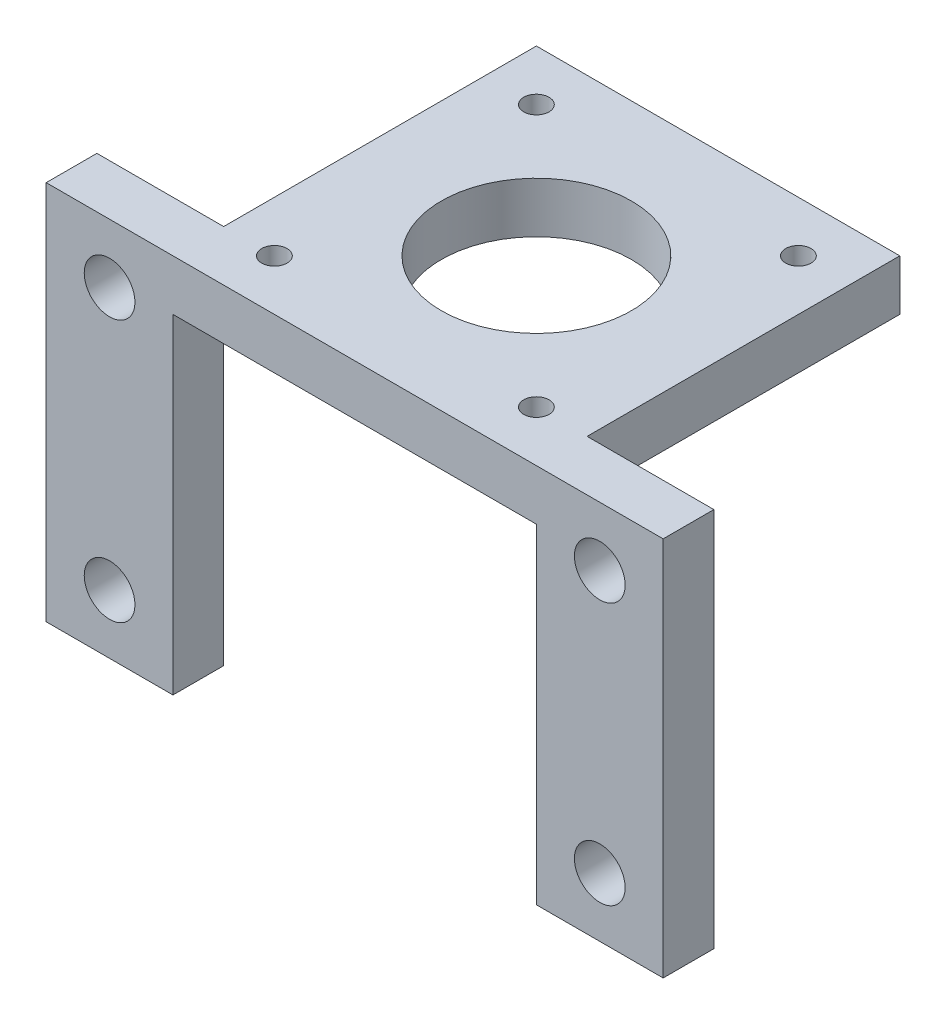
ISO-10303-21;
HEADER;
FILE_DESCRIPTION(('STEP AP214'),'2;1');
FILE_NAME('part.step','',(''),(''),'','','');
FILE_SCHEMA(('AUTOMOTIVE_DESIGN { 1 0 10303 214 1 1 1 1 }'));
ENDSEC;
DATA;
#1=APPLICATION_CONTEXT('core data for automotive mechanical design processes');
#2=APPLICATION_PROTOCOL_DEFINITION('international standard','automotive_design',2000,#1);
#3=PRODUCT_CONTEXT('',#1,'mechanical');
#4=PRODUCT('Part','Part','',(#3));
#5=PRODUCT_RELATED_PRODUCT_CATEGORY('part','',(#4));
#6=PRODUCT_DEFINITION_FORMATION('','',#4);
#7=PRODUCT_DEFINITION_CONTEXT('part definition',#1,'design');
#8=PRODUCT_DEFINITION('design','',#6,#7);
#9=PRODUCT_DEFINITION_SHAPE('','',#8);
#10=(LENGTH_UNIT() NAMED_UNIT(*) SI_UNIT(.MILLI.,.METRE.));
#11=(NAMED_UNIT(*) PLANE_ANGLE_UNIT() SI_UNIT($,.RADIAN.));
#12=(NAMED_UNIT(*) SI_UNIT($,.STERADIAN.) SOLID_ANGLE_UNIT());
#13=UNCERTAINTY_MEASURE_WITH_UNIT(LENGTH_MEASURE(1.E-05),#10,'distance_accuracy_value','');
#14=(GEOMETRIC_REPRESENTATION_CONTEXT(3) GLOBAL_UNCERTAINTY_ASSIGNED_CONTEXT((#13)) GLOBAL_UNIT_ASSIGNED_CONTEXT((#10,
#11,#12)) REPRESENTATION_CONTEXT('',''));
#15=CARTESIAN_POINT('',(0.,0.,0.));
#16=DIRECTION('',(0.,0.,1.));
#17=DIRECTION('',(1.,0.,0.));
#18=AXIS2_PLACEMENT_3D('',#15,#16,#17);
#19=CARTESIAN_POINT('',(21.5,6.,21.5));
#20=DIRECTION('',(-1.,0.,0.));
#21=DIRECTION('',(0.,0.,1.));
#22=AXIS2_PLACEMENT_3D('',#19,#20,#21);
#23=PLANE('',#22);
#24=DIRECTION('',(0.,1.,0.));
#25=VECTOR('',#24,1.);
#26=CARTESIAN_POINT('',(21.5,-39.,15.5));
#27=LINE('',#26,#25);
#28=CARTESIAN_POINT('',(21.5,0.,15.5));
#29=VERTEX_POINT('',#28);
#30=CARTESIAN_POINT('',(21.5,6.,15.5));
#31=VERTEX_POINT('',#30);
#32=EDGE_CURVE('E11',#29,#31,#27,.T.);
#33=ORIENTED_EDGE('',*,*,#32,.F.);
#34=DIRECTION('',(0.,0.,-1.));
#35=VECTOR('',#34,1.);
#36=CARTESIAN_POINT('',(21.5,0.,21.5));
#37=LINE('',#36,#35);
#38=CARTESIAN_POINT('',(21.5,0.,-21.5));
#39=VERTEX_POINT('',#38);
#40=EDGE_CURVE('E213',#29,#39,#37,.T.);
#41=ORIENTED_EDGE('',*,*,#40,.T.);
#42=DIRECTION('',(0.,-1.,0.));
#43=VECTOR('',#42,1.);
#44=CARTESIAN_POINT('',(21.5,6.,-21.5));
#45=LINE('',#44,#43);
#46=CARTESIAN_POINT('',(21.5,6.,-21.5));
#47=VERTEX_POINT('',#46);
#48=EDGE_CURVE('E36',#47,#39,#45,.T.);
#49=ORIENTED_EDGE('',*,*,#48,.F.);
#50=DIRECTION('',(0.,0.,-1.));
#51=VECTOR('',#50,1.);
#52=CARTESIAN_POINT('',(21.5,6.,21.5));
#53=LINE('',#52,#51);
#54=EDGE_CURVE('E216',#31,#47,#53,.T.);
#55=ORIENTED_EDGE('',*,*,#54,.F.);
#56=EDGE_LOOP('',(#33,#41,#49,#55));
#57=FACE_BOUND('',#56,.T.);
#58=ADVANCED_FACE('F33',(#57),#23,.F.);
#59=CARTESIAN_POINT('',(0.,6.,0.));
#60=DIRECTION('',(0.,-1.,0.));
#61=DIRECTION('',(0.,0.,-1.));
#62=AXIS2_PLACEMENT_3D('',#59,#60,#61);
#63=PLANE('',#62);
#64=DIRECTION('',(1.,0.,0.));
#65=VECTOR('',#64,1.);
#66=CARTESIAN_POINT('',(-21.5,6.,21.5));
#67=LINE('',#66,#65);
#68=CARTESIAN_POINT('',(-36.5,6.,21.5));
#69=VERTEX_POINT('',#68);
#70=CARTESIAN_POINT('',(36.5,6.,21.5));
#71=VERTEX_POINT('',#70);
#72=EDGE_CURVE('E223',#69,#71,#67,.T.);
#73=ORIENTED_EDGE('',*,*,#72,.T.);
#74=DIRECTION('',(0.,0.,-1.));
#75=VECTOR('',#74,1.);
#76=CARTESIAN_POINT('',(36.5,6.,21.5));
#77=LINE('',#76,#75);
#78=CARTESIAN_POINT('',(36.5,6.,15.5));
#79=VERTEX_POINT('',#78);
#80=EDGE_CURVE('E146',#71,#79,#77,.T.);
#81=ORIENTED_EDGE('',*,*,#80,.T.);
#82=DIRECTION('',(-1.,0.,0.));
#83=VECTOR('',#82,1.);
#84=CARTESIAN_POINT('',(21.5,6.,15.5));
#85=LINE('',#84,#83);
#86=EDGE_CURVE('E143',#79,#31,#85,.T.);
#87=ORIENTED_EDGE('',*,*,#86,.T.);
#88=ORIENTED_EDGE('',*,*,#54,.T.);
#89=DIRECTION('',(-1.,0.,0.));
#90=VECTOR('',#89,1.);
#91=CARTESIAN_POINT('',(-21.5,6.,-21.5));
#92=LINE('',#91,#90);
#93=CARTESIAN_POINT('',(-21.5,6.,-21.5));
#94=VERTEX_POINT('',#93);
#95=EDGE_CURVE('E218',#47,#94,#92,.T.);
#96=ORIENTED_EDGE('',*,*,#95,.T.);
#97=DIRECTION('',(0.,0.,1.));
#98=VECTOR('',#97,1.);
#99=CARTESIAN_POINT('',(-21.5,6.,21.5));
#100=LINE('',#99,#98);
#101=CARTESIAN_POINT('',(-21.5,6.,15.5));
#102=VERTEX_POINT('',#101);
#103=EDGE_CURVE('E220',#94,#102,#100,.T.);
#104=ORIENTED_EDGE('',*,*,#103,.T.);
#105=DIRECTION('',(-1.,0.,0.));
#106=VECTOR('',#105,1.);
#107=CARTESIAN_POINT('',(-21.5,6.,15.5));
#108=LINE('',#107,#106);
#109=CARTESIAN_POINT('',(-36.5,6.,15.5));
#110=VERTEX_POINT('',#109);
#111=EDGE_CURVE('E56',#102,#110,#108,.T.);
#112=ORIENTED_EDGE('',*,*,#111,.T.);
#113=DIRECTION('',(0.,0.,1.));
#114=VECTOR('',#113,1.);
#115=CARTESIAN_POINT('',(-36.5,6.,21.5));
#116=LINE('',#115,#114);
#117=EDGE_CURVE('E163',#110,#69,#116,.T.);
#118=ORIENTED_EDGE('',*,*,#117,.T.);
#119=EDGE_LOOP('',(#73,#81,#87,#88,#96,#104,#112,#118));
#120=FACE_BOUND('',#119,.T.);
#121=CARTESIAN_POINT('',(-15.5,6.,-15.5));
#122=DIRECTION('',(0.,1.,0.));
#123=DIRECTION('',(0.,0.,1.));
#124=AXIS2_PLACEMENT_3D('',#121,#122,#123);
#125=CIRCLE('',#124,1.5);
#126=CARTESIAN_POINT('',(-15.5,6.,-14.));
#127=VERTEX_POINT('',#126);
#128=EDGE_CURVE('E210',#127,#127,#125,.T.);
#129=ORIENTED_EDGE('',*,*,#128,.F.);
#130=EDGE_LOOP('',(#129));
#131=FACE_BOUND('',#130,.T.);
#132=CARTESIAN_POINT('',(15.5,6.,-15.5));
#133=DIRECTION('',(0.,1.,0.));
#134=DIRECTION('',(0.,0.,1.));
#135=AXIS2_PLACEMENT_3D('',#132,#133,#134);
#136=CIRCLE('',#135,1.5);
#137=CARTESIAN_POINT('',(15.5,6.,-14.));
#138=VERTEX_POINT('',#137);
#139=EDGE_CURVE('E204',#138,#138,#136,.T.);
#140=ORIENTED_EDGE('',*,*,#139,.F.);
#141=EDGE_LOOP('',(#140));
#142=FACE_BOUND('',#141,.T.);
#143=CARTESIAN_POINT('',(-15.5,6.,15.5));
#144=DIRECTION('',(0.,1.,0.));
#145=DIRECTION('',(0.,0.,1.));
#146=AXIS2_PLACEMENT_3D('',#143,#144,#145);
#147=CIRCLE('',#146,1.5);
#148=CARTESIAN_POINT('',(-15.5,6.,17.));
#149=VERTEX_POINT('',#148);
#150=EDGE_CURVE('E198',#149,#149,#147,.T.);
#151=ORIENTED_EDGE('',*,*,#150,.F.);
#152=EDGE_LOOP('',(#151));
#153=FACE_BOUND('',#152,.T.);
#154=CARTESIAN_POINT('',(15.5,6.,15.5));
#155=DIRECTION('',(0.,1.,0.));
#156=DIRECTION('',(0.,0.,1.));
#157=AXIS2_PLACEMENT_3D('',#154,#155,#156);
#158=CIRCLE('',#157,1.5);
#159=CARTESIAN_POINT('',(15.5,6.,17.));
#160=VERTEX_POINT('',#159);
#161=EDGE_CURVE('E192',#160,#160,#158,.T.);
#162=ORIENTED_EDGE('',*,*,#161,.F.);
#163=EDGE_LOOP('',(#162));
#164=FACE_BOUND('',#163,.T.);
#165=CARTESIAN_POINT('',(0.,6.,0.));
#166=DIRECTION('',(0.,1.,0.));
#167=DIRECTION('',(0.,0.,1.));
#168=AXIS2_PLACEMENT_3D('',#165,#166,#167);
#169=CIRCLE('',#168,11.25);
#170=CARTESIAN_POINT('',(0.,6.,11.25));
#171=VERTEX_POINT('',#170);
#172=EDGE_CURVE('E186',#171,#171,#169,.T.);
#173=ORIENTED_EDGE('',*,*,#172,.F.);
#174=EDGE_LOOP('',(#173));
#175=FACE_BOUND('',#174,.T.);
#176=ADVANCED_FACE('F245',(#120,#131,#142,#153,#164,#175),#63,.F.);
#177=CARTESIAN_POINT('',(0.,0.,0.));
#178=DIRECTION('',(0.,-1.,0.));
#179=DIRECTION('',(0.,0.,-1.));
#180=AXIS2_PLACEMENT_3D('',#177,#178,#179);
#181=PLANE('',#180);
#182=CARTESIAN_POINT('',(15.5,0.,15.5));
#183=DIRECTION('',(0.,1.,0.));
#184=DIRECTION('',(0.,0.,1.));
#185=AXIS2_PLACEMENT_3D('',#182,#183,#184);
#186=CIRCLE('',#185,1.5);
#187=CARTESIAN_POINT('',(15.5,0.,17.));
#188=VERTEX_POINT('',#187);
#189=EDGE_CURVE('E189',#188,#188,#186,.T.);
#190=ORIENTED_EDGE('',*,*,#189,.T.);
#191=EDGE_LOOP('',(#190));
#192=FACE_BOUND('',#191,.T.);
#193=CARTESIAN_POINT('',(15.5,0.,-15.5));
#194=DIRECTION('',(0.,1.,0.));
#195=DIRECTION('',(0.,0.,1.));
#196=AXIS2_PLACEMENT_3D('',#193,#194,#195);
#197=CIRCLE('',#196,1.5);
#198=CARTESIAN_POINT('',(15.5,0.,-14.));
#199=VERTEX_POINT('',#198);
#200=EDGE_CURVE('E201',#199,#199,#197,.T.);
#201=ORIENTED_EDGE('',*,*,#200,.T.);
#202=EDGE_LOOP('',(#201));
#203=FACE_BOUND('',#202,.T.);
#204=CARTESIAN_POINT('',(21.5,0.,21.5));
#205=VERTEX_POINT('',#204);
#206=EDGE_CURVE('E226',#205,#29,#37,.T.);
#207=ORIENTED_EDGE('',*,*,#206,.F.);
#208=DIRECTION('',(1.,0.,0.));
#209=VECTOR('',#208,1.);
#210=CARTESIAN_POINT('',(-21.5,0.,21.5));
#211=LINE('',#210,#209);
#212=CARTESIAN_POINT('',(-21.5,0.,21.5));
#213=VERTEX_POINT('',#212);
#214=EDGE_CURVE('E123',#213,#205,#211,.T.);
#215=ORIENTED_EDGE('',*,*,#214,.F.);
#216=DIRECTION('',(0.,0.,1.));
#217=VECTOR('',#216,1.);
#218=CARTESIAN_POINT('',(-21.5,0.,21.5));
#219=LINE('',#218,#217);
#220=CARTESIAN_POINT('',(-21.5,0.,15.5));
#221=VERTEX_POINT('',#220);
#222=EDGE_CURVE('E230',#221,#213,#219,.T.);
#223=ORIENTED_EDGE('',*,*,#222,.F.);
#224=CARTESIAN_POINT('',(-21.5,0.,-21.5));
#225=VERTEX_POINT('',#224);
#226=EDGE_CURVE('E231',#225,#221,#219,.T.);
#227=ORIENTED_EDGE('',*,*,#226,.F.);
#228=DIRECTION('',(-1.,0.,0.));
#229=VECTOR('',#228,1.);
#230=CARTESIAN_POINT('',(-21.5,0.,-21.5));
#231=LINE('',#230,#229);
#232=EDGE_CURVE('E228',#39,#225,#231,.T.);
#233=ORIENTED_EDGE('',*,*,#232,.F.);
#234=ORIENTED_EDGE('',*,*,#40,.F.);
#235=EDGE_LOOP('',(#207,#215,#223,#227,#233,#234));
#236=FACE_BOUND('',#235,.T.);
#237=CARTESIAN_POINT('',(-15.5,0.,-15.5));
#238=DIRECTION('',(0.,1.,0.));
#239=DIRECTION('',(0.,0.,1.));
#240=AXIS2_PLACEMENT_3D('',#237,#238,#239);
#241=CIRCLE('',#240,1.5);
#242=CARTESIAN_POINT('',(-15.5,0.,-14.));
#243=VERTEX_POINT('',#242);
#244=EDGE_CURVE('E207',#243,#243,#241,.T.);
#245=ORIENTED_EDGE('',*,*,#244,.T.);
#246=EDGE_LOOP('',(#245));
#247=FACE_BOUND('',#246,.T.);
#248=CARTESIAN_POINT('',(-15.5,0.,15.5));
#249=DIRECTION('',(0.,1.,0.));
#250=DIRECTION('',(0.,0.,1.));
#251=AXIS2_PLACEMENT_3D('',#248,#249,#250);
#252=CIRCLE('',#251,1.5);
#253=CARTESIAN_POINT('',(-15.5,0.,17.));
#254=VERTEX_POINT('',#253);
#255=EDGE_CURVE('E195',#254,#254,#252,.T.);
#256=ORIENTED_EDGE('',*,*,#255,.T.);
#257=EDGE_LOOP('',(#256));
#258=FACE_BOUND('',#257,.T.);
#259=CARTESIAN_POINT('',(0.,0.,0.));
#260=DIRECTION('',(0.,1.,0.));
#261=DIRECTION('',(0.,0.,1.));
#262=AXIS2_PLACEMENT_3D('',#259,#260,#261);
#263=CIRCLE('',#262,11.25);
#264=CARTESIAN_POINT('',(0.,0.,11.25));
#265=VERTEX_POINT('',#264);
#266=EDGE_CURVE('E178',#265,#265,#263,.T.);
#267=ORIENTED_EDGE('',*,*,#266,.T.);
#268=EDGE_LOOP('',(#267));
#269=FACE_BOUND('',#268,.T.);
#270=ADVANCED_FACE('F250',(#192,#203,#236,#247,#258,#269),#181,.T.);
#271=CARTESIAN_POINT('',(-21.5,6.,-21.5));
#272=DIRECTION('',(0.,0.,1.));
#273=DIRECTION('',(1.,0.,0.));
#274=AXIS2_PLACEMENT_3D('',#271,#272,#273);
#275=PLANE('',#274);
#276=ORIENTED_EDGE('',*,*,#232,.T.);
#277=DIRECTION('',(0.,-1.,0.));
#278=VECTOR('',#277,1.);
#279=CARTESIAN_POINT('',(-21.5,6.,-21.5));
#280=LINE('',#279,#278);
#281=EDGE_CURVE('E225',#94,#225,#280,.T.);
#282=ORIENTED_EDGE('',*,*,#281,.F.);
#283=ORIENTED_EDGE('',*,*,#95,.F.);
#284=ORIENTED_EDGE('',*,*,#48,.T.);
#285=EDGE_LOOP('',(#276,#282,#283,#284));
#286=FACE_BOUND('',#285,.T.);
#287=ADVANCED_FACE('F247',(#286),#275,.F.);
#288=CARTESIAN_POINT('',(-21.5,6.,21.5));
#289=DIRECTION('',(1.,0.,0.));
#290=DIRECTION('',(0.,0.,-1.));
#291=AXIS2_PLACEMENT_3D('',#288,#289,#290);
#292=PLANE('',#291);
#293=ORIENTED_EDGE('',*,*,#226,.T.);
#294=DIRECTION('',(0.,1.,0.));
#295=VECTOR('',#294,1.);
#296=CARTESIAN_POINT('',(-21.5,-39.,15.5));
#297=LINE('',#296,#295);
#298=EDGE_CURVE('E41',#221,#102,#297,.T.);
#299=ORIENTED_EDGE('',*,*,#298,.T.);
#300=ORIENTED_EDGE('',*,*,#103,.F.);
#301=ORIENTED_EDGE('',*,*,#281,.T.);
#302=EDGE_LOOP('',(#293,#299,#300,#301));
#303=FACE_BOUND('',#302,.T.);
#304=ADVANCED_FACE('F243',(#303),#292,.F.);
#305=CARTESIAN_POINT('',(-21.5,6.,21.5));
#306=DIRECTION('',(0.,0.,-1.));
#307=DIRECTION('',(-1.,0.,0.));
#308=AXIS2_PLACEMENT_3D('',#305,#306,#307);
#309=PLANE('',#308);
#310=CARTESIAN_POINT('',(-29.,-32.,21.5));
#311=DIRECTION('',(0.,0.,-1.));
#312=DIRECTION('',(-1.,0.,0.));
#313=AXIS2_PLACEMENT_3D('',#310,#311,#312);
#314=CIRCLE('',#313,3.);
#315=CARTESIAN_POINT('',(-32.,-32.,21.5));
#316=VERTEX_POINT('',#315);
#317=EDGE_CURVE('E149',#316,#316,#314,.T.);
#318=ORIENTED_EDGE('',*,*,#317,.T.);
#319=EDGE_LOOP('',(#318));
#320=FACE_BOUND('',#319,.T.);
#321=CARTESIAN_POINT('',(-29.,-0.999999999999987,21.5));
#322=DIRECTION('',(0.,0.,-1.));
#323=DIRECTION('',(-1.,0.,0.));
#324=AXIS2_PLACEMENT_3D('',#321,#322,#323);
#325=CIRCLE('',#324,2.99999999999999);
#326=CARTESIAN_POINT('',(-32.,-0.999999999999987,21.5));
#327=VERTEX_POINT('',#326);
#328=EDGE_CURVE('E444',#327,#327,#325,.T.);
#329=ORIENTED_EDGE('',*,*,#328,.T.);
#330=EDGE_LOOP('',(#329));
#331=FACE_BOUND('',#330,.T.);
#332=CARTESIAN_POINT('',(29.,-1.,21.5));
#333=DIRECTION('',(0.,0.,-1.));
#334=DIRECTION('',(-1.,0.,0.));
#335=AXIS2_PLACEMENT_3D('',#332,#333,#334);
#336=CIRCLE('',#335,2.99999999999999);
#337=CARTESIAN_POINT('',(26.,-1.,21.5));
#338=VERTEX_POINT('',#337);
#339=EDGE_CURVE('E446',#338,#338,#336,.T.);
#340=ORIENTED_EDGE('',*,*,#339,.T.);
#341=EDGE_LOOP('',(#340));
#342=FACE_BOUND('',#341,.T.);
#343=CARTESIAN_POINT('',(29.,-32.,21.5));
#344=DIRECTION('',(0.,0.,-1.));
#345=DIRECTION('',(-1.,0.,0.));
#346=AXIS2_PLACEMENT_3D('',#343,#344,#345);
#347=CIRCLE('',#346,3.);
#348=CARTESIAN_POINT('',(26.,-32.,21.5));
#349=VERTEX_POINT('',#348);
#350=EDGE_CURVE('E450',#349,#349,#347,.T.);
#351=ORIENTED_EDGE('',*,*,#350,.T.);
#352=EDGE_LOOP('',(#351));
#353=FACE_BOUND('',#352,.T.);
#354=ORIENTED_EDGE('',*,*,#214,.T.);
#355=DIRECTION('',(0.,1.,0.));
#356=VECTOR('',#355,1.);
#357=CARTESIAN_POINT('',(21.5,-39.,21.5));
#358=LINE('',#357,#356);
#359=CARTESIAN_POINT('',(21.5,-39.,21.5));
#360=VERTEX_POINT('',#359);
#361=EDGE_CURVE('E116',#360,#205,#358,.T.);
#362=ORIENTED_EDGE('',*,*,#361,.F.);
#363=DIRECTION('',(1.,0.,0.));
#364=VECTOR('',#363,1.);
#365=CARTESIAN_POINT('',(21.5,-39.,21.5));
#366=LINE('',#365,#364);
#367=CARTESIAN_POINT('',(36.5,-39.,21.5));
#368=VERTEX_POINT('',#367);
#369=EDGE_CURVE('E120',#360,#368,#366,.T.);
#370=ORIENTED_EDGE('',*,*,#369,.T.);
#371=DIRECTION('',(0.,1.,0.));
#372=VECTOR('',#371,1.);
#373=CARTESIAN_POINT('',(36.5,-39.,21.5));
#374=LINE('',#373,#372);
#375=EDGE_CURVE('E128',#368,#71,#374,.T.);
#376=ORIENTED_EDGE('',*,*,#375,.T.);
#377=ORIENTED_EDGE('',*,*,#72,.F.);
#378=DIRECTION('',(0.,1.,0.));
#379=VECTOR('',#378,1.);
#380=CARTESIAN_POINT('',(-36.5,-39.,21.5));
#381=LINE('',#380,#379);
#382=CARTESIAN_POINT('',(-36.5,-39.,21.5));
#383=VERTEX_POINT('',#382);
#384=EDGE_CURVE('E179',#383,#69,#381,.T.);
#385=ORIENTED_EDGE('',*,*,#384,.F.);
#386=DIRECTION('',(1.,0.,0.));
#387=VECTOR('',#386,1.);
#388=CARTESIAN_POINT('',(-21.5,-39.,21.5));
#389=LINE('',#388,#387);
#390=CARTESIAN_POINT('',(-21.5,-39.,21.5));
#391=VERTEX_POINT('',#390);
#392=EDGE_CURVE('E169',#383,#391,#389,.T.);
#393=ORIENTED_EDGE('',*,*,#392,.T.);
#394=DIRECTION('',(0.,1.,0.));
#395=VECTOR('',#394,1.);
#396=CARTESIAN_POINT('',(-21.5,-39.,21.5));
#397=LINE('',#396,#395);
#398=EDGE_CURVE('E176',#391,#213,#397,.T.);
#399=ORIENTED_EDGE('',*,*,#398,.T.);
#400=EDGE_LOOP('',(#354,#362,#370,#376,#377,#385,#393,#399));
#401=FACE_BOUND('',#400,.T.);
#402=ADVANCED_FACE('F118',(#320,#331,#342,#353,#401),#309,.F.);
#403=CARTESIAN_POINT('',(-15.5,6.,-15.5));
#404=DIRECTION('',(0.,-1.,0.));
#405=DIRECTION('',(0.,0.,-1.));
#406=AXIS2_PLACEMENT_3D('',#403,#404,#405);
#407=CYLINDRICAL_SURFACE('',#406,1.5);
#408=ORIENTED_EDGE('',*,*,#128,.T.);
#409=EDGE_LOOP('',(#408));
#410=FACE_BOUND('',#409,.T.);
#411=ORIENTED_EDGE('',*,*,#244,.F.);
#412=EDGE_LOOP('',(#411));
#413=FACE_BOUND('',#412,.T.);
#414=ADVANCED_FACE('F294',(#410,#413),#407,.F.);
#415=CARTESIAN_POINT('',(15.5,6.,-15.5));
#416=DIRECTION('',(0.,-1.,0.));
#417=DIRECTION('',(0.,0.,-1.));
#418=AXIS2_PLACEMENT_3D('',#415,#416,#417);
#419=CYLINDRICAL_SURFACE('',#418,1.5);
#420=ORIENTED_EDGE('',*,*,#139,.T.);
#421=EDGE_LOOP('',(#420));
#422=FACE_BOUND('',#421,.T.);
#423=ORIENTED_EDGE('',*,*,#200,.F.);
#424=EDGE_LOOP('',(#423));
#425=FACE_BOUND('',#424,.T.);
#426=ADVANCED_FACE('F323',(#422,#425),#419,.F.);
#427=CARTESIAN_POINT('',(-15.5,6.,15.5));
#428=DIRECTION('',(0.,-1.,0.));
#429=DIRECTION('',(0.,0.,-1.));
#430=AXIS2_PLACEMENT_3D('',#427,#428,#429);
#431=CYLINDRICAL_SURFACE('',#430,1.5);
#432=ORIENTED_EDGE('',*,*,#150,.T.);
#433=EDGE_LOOP('',(#432));
#434=FACE_BOUND('',#433,.T.);
#435=ORIENTED_EDGE('',*,*,#255,.F.);
#436=EDGE_LOOP('',(#435));
#437=FACE_BOUND('',#436,.T.);
#438=ADVANCED_FACE('F330',(#434,#437),#431,.F.);
#439=CARTESIAN_POINT('',(15.5,6.,15.5));
#440=DIRECTION('',(0.,-1.,0.));
#441=DIRECTION('',(0.,0.,-1.));
#442=AXIS2_PLACEMENT_3D('',#439,#440,#441);
#443=CYLINDRICAL_SURFACE('',#442,1.5);
#444=ORIENTED_EDGE('',*,*,#161,.T.);
#445=EDGE_LOOP('',(#444));
#446=FACE_BOUND('',#445,.T.);
#447=ORIENTED_EDGE('',*,*,#189,.F.);
#448=EDGE_LOOP('',(#447));
#449=FACE_BOUND('',#448,.T.);
#450=ADVANCED_FACE('F337',(#446,#449),#443,.F.);
#451=CARTESIAN_POINT('',(0.,6.,0.));
#452=DIRECTION('',(0.,-1.,0.));
#453=DIRECTION('',(0.,0.,-1.));
#454=AXIS2_PLACEMENT_3D('',#451,#452,#453);
#455=CYLINDRICAL_SURFACE('',#454,11.25);
#456=ORIENTED_EDGE('',*,*,#172,.T.);
#457=EDGE_LOOP('',(#456));
#458=FACE_BOUND('',#457,.T.);
#459=ORIENTED_EDGE('',*,*,#266,.F.);
#460=EDGE_LOOP('',(#459));
#461=FACE_BOUND('',#460,.T.);
#462=ADVANCED_FACE('F345',(#458,#461),#455,.F.);
#463=CARTESIAN_POINT('',(-21.5,-39.,21.5));
#464=DIRECTION('',(1.,0.,0.));
#465=DIRECTION('',(0.,0.,-1.));
#466=AXIS2_PLACEMENT_3D('',#463,#464,#465);
#467=PLANE('',#466);
#468=CARTESIAN_POINT('',(-21.5,-39.,15.5));
#469=VERTEX_POINT('',#468);
#470=EDGE_CURVE('E172',#469,#221,#297,.T.);
#471=ORIENTED_EDGE('',*,*,#470,.T.);
#472=ORIENTED_EDGE('',*,*,#222,.T.);
#473=ORIENTED_EDGE('',*,*,#398,.F.);
#474=DIRECTION('',(0.,0.,-1.));
#475=VECTOR('',#474,1.);
#476=CARTESIAN_POINT('',(-21.5,-39.,21.5));
#477=LINE('',#476,#475);
#478=EDGE_CURVE('E159',#391,#469,#477,.T.);
#479=ORIENTED_EDGE('',*,*,#478,.T.);
#480=EDGE_LOOP('',(#471,#472,#473,#479));
#481=FACE_BOUND('',#480,.T.);
#482=ADVANCED_FACE('F254',(#481),#467,.T.);
#483=CARTESIAN_POINT('',(-36.5,-39.,21.5));
#484=DIRECTION('',(-1.,0.,0.));
#485=DIRECTION('',(0.,0.,1.));
#486=AXIS2_PLACEMENT_3D('',#483,#484,#485);
#487=PLANE('',#486);
#488=ORIENTED_EDGE('',*,*,#117,.F.);
#489=DIRECTION('',(0.,1.,0.));
#490=VECTOR('',#489,1.);
#491=CARTESIAN_POINT('',(-36.5,-39.,15.5));
#492=LINE('',#491,#490);
#493=CARTESIAN_POINT('',(-36.5,-39.,15.5));
#494=VERTEX_POINT('',#493);
#495=EDGE_CURVE('E182',#494,#110,#492,.T.);
#496=ORIENTED_EDGE('',*,*,#495,.F.);
#497=DIRECTION('',(0.,0.,1.));
#498=VECTOR('',#497,1.);
#499=CARTESIAN_POINT('',(-36.5,-39.,21.5));
#500=LINE('',#499,#498);
#501=EDGE_CURVE('E166',#494,#383,#500,.T.);
#502=ORIENTED_EDGE('',*,*,#501,.T.);
#503=ORIENTED_EDGE('',*,*,#384,.T.);
#504=EDGE_LOOP('',(#488,#496,#502,#503));
#505=FACE_BOUND('',#504,.T.);
#506=ADVANCED_FACE('F264',(#505),#487,.T.);
#507=CARTESIAN_POINT('',(-21.5,-39.,15.5));
#508=DIRECTION('',(0.,0.,-1.));
#509=DIRECTION('',(-1.,0.,0.));
#510=AXIS2_PLACEMENT_3D('',#507,#508,#509);
#511=PLANE('',#510);
#512=CARTESIAN_POINT('',(-29.,-32.,15.5));
#513=DIRECTION('',(0.,0.,-1.));
#514=DIRECTION('',(1.,0.,0.));
#515=AXIS2_PLACEMENT_3D('',#512,#513,#514);
#516=CIRCLE('',#515,3.);
#517=CARTESIAN_POINT('',(-32.,-32.,15.5));
#518=VERTEX_POINT('',#517);
#519=EDGE_CURVE('E441',#518,#518,#516,.T.);
#520=ORIENTED_EDGE('',*,*,#519,.F.);
#521=EDGE_LOOP('',(#520));
#522=FACE_BOUND('',#521,.T.);
#523=CARTESIAN_POINT('',(-29.,-0.999999999999987,15.5));
#524=DIRECTION('',(0.,0.,-1.));
#525=DIRECTION('',(1.,0.,0.));
#526=AXIS2_PLACEMENT_3D('',#523,#524,#525);
#527=CIRCLE('',#526,2.99999999999999);
#528=CARTESIAN_POINT('',(-32.,-0.999999999999987,15.5));
#529=VERTEX_POINT('',#528);
#530=EDGE_CURVE('E460',#529,#529,#527,.T.);
#531=ORIENTED_EDGE('',*,*,#530,.F.);
#532=EDGE_LOOP('',(#531));
#533=FACE_BOUND('',#532,.T.);
#534=ORIENTED_EDGE('',*,*,#111,.F.);
#535=ORIENTED_EDGE('',*,*,#298,.F.);
#536=ORIENTED_EDGE('',*,*,#470,.F.);
#537=DIRECTION('',(-1.,0.,0.));
#538=VECTOR('',#537,1.);
#539=CARTESIAN_POINT('',(-21.5,-39.,15.5));
#540=LINE('',#539,#538);
#541=EDGE_CURVE('E162',#469,#494,#540,.T.);
#542=ORIENTED_EDGE('',*,*,#541,.T.);
#543=ORIENTED_EDGE('',*,*,#495,.T.);
#544=EDGE_LOOP('',(#534,#535,#536,#542,#543));
#545=FACE_BOUND('',#544,.T.);
#546=ADVANCED_FACE('F261',(#522,#533,#545),#511,.T.);
#547=CARTESIAN_POINT('',(0.,-39.,0.));
#548=DIRECTION('',(0.,1.,0.));
#549=DIRECTION('',(0.,0.,1.));
#550=AXIS2_PLACEMENT_3D('',#547,#548,#549);
#551=PLANE('',#550);
#552=ORIENTED_EDGE('',*,*,#478,.F.);
#553=ORIENTED_EDGE('',*,*,#392,.F.);
#554=ORIENTED_EDGE('',*,*,#501,.F.);
#555=ORIENTED_EDGE('',*,*,#541,.F.);
#556=EDGE_LOOP('',(#552,#553,#554,#555));
#557=FACE_BOUND('',#556,.T.);
#558=ADVANCED_FACE('F259',(#557),#551,.F.);
#559=CARTESIAN_POINT('',(21.5,-39.,21.5));
#560=DIRECTION('',(-1.,0.,0.));
#561=DIRECTION('',(0.,0.,1.));
#562=AXIS2_PLACEMENT_3D('',#559,#560,#561);
#563=PLANE('',#562);
#564=ORIENTED_EDGE('',*,*,#361,.T.);
#565=ORIENTED_EDGE('',*,*,#206,.T.);
#566=CARTESIAN_POINT('',(21.5,-39.,15.5));
#567=VERTEX_POINT('',#566);
#568=EDGE_CURVE('E43',#567,#29,#27,.T.);
#569=ORIENTED_EDGE('',*,*,#568,.F.);
#570=DIRECTION('',(0.,0.,1.));
#571=VECTOR('',#570,1.);
#572=CARTESIAN_POINT('',(21.5,-39.,21.5));
#573=LINE('',#572,#571);
#574=EDGE_CURVE('E136',#567,#360,#573,.T.);
#575=ORIENTED_EDGE('',*,*,#574,.T.);
#576=EDGE_LOOP('',(#564,#565,#569,#575));
#577=FACE_BOUND('',#576,.T.);
#578=ADVANCED_FACE('F141',(#577),#563,.T.);
#579=CARTESIAN_POINT('',(21.5,-39.,15.5));
#580=DIRECTION('',(0.,0.,-1.));
#581=DIRECTION('',(-1.,0.,0.));
#582=AXIS2_PLACEMENT_3D('',#579,#580,#581);
#583=PLANE('',#582);
#584=CARTESIAN_POINT('',(29.,-1.,15.5));
#585=DIRECTION('',(0.,0.,-1.));
#586=DIRECTION('',(-1.,0.,0.));
#587=AXIS2_PLACEMENT_3D('',#584,#585,#586);
#588=CIRCLE('',#587,2.99999999999999);
#589=CARTESIAN_POINT('',(26.,-1.,15.5));
#590=VERTEX_POINT('',#589);
#591=EDGE_CURVE('E458',#590,#590,#588,.T.);
#592=ORIENTED_EDGE('',*,*,#591,.F.);
#593=EDGE_LOOP('',(#592));
#594=FACE_BOUND('',#593,.T.);
#595=CARTESIAN_POINT('',(29.,-32.,15.5));
#596=DIRECTION('',(0.,0.,-1.));
#597=DIRECTION('',(-1.,0.,0.));
#598=AXIS2_PLACEMENT_3D('',#595,#596,#597);
#599=CIRCLE('',#598,3.);
#600=CARTESIAN_POINT('',(26.,-32.,15.5));
#601=VERTEX_POINT('',#600);
#602=EDGE_CURVE('E455',#601,#601,#599,.T.);
#603=ORIENTED_EDGE('',*,*,#602,.F.);
#604=EDGE_LOOP('',(#603));
#605=FACE_BOUND('',#604,.T.);
#606=ORIENTED_EDGE('',*,*,#86,.F.);
#607=DIRECTION('',(0.,1.,0.));
#608=VECTOR('',#607,1.);
#609=CARTESIAN_POINT('',(36.5,-39.,15.5));
#610=LINE('',#609,#608);
#611=CARTESIAN_POINT('',(36.5,-39.,15.5));
#612=VERTEX_POINT('',#611);
#613=EDGE_CURVE('E156',#612,#79,#610,.T.);
#614=ORIENTED_EDGE('',*,*,#613,.F.);
#615=DIRECTION('',(-1.,0.,0.));
#616=VECTOR('',#615,1.);
#617=CARTESIAN_POINT('',(21.5,-39.,15.5));
#618=LINE('',#617,#616);
#619=EDGE_CURVE('E129',#612,#567,#618,.T.);
#620=ORIENTED_EDGE('',*,*,#619,.T.);
#621=ORIENTED_EDGE('',*,*,#568,.T.);
#622=ORIENTED_EDGE('',*,*,#32,.T.);
#623=EDGE_LOOP('',(#606,#614,#620,#621,#622));
#624=FACE_BOUND('',#623,.T.);
#625=ADVANCED_FACE('F270',(#594,#605,#624),#583,.T.);
#626=CARTESIAN_POINT('',(36.5,-39.,21.5));
#627=DIRECTION('',(1.,0.,0.));
#628=DIRECTION('',(0.,0.,-1.));
#629=AXIS2_PLACEMENT_3D('',#626,#627,#628);
#630=PLANE('',#629);
#631=ORIENTED_EDGE('',*,*,#80,.F.);
#632=ORIENTED_EDGE('',*,*,#375,.F.);
#633=DIRECTION('',(0.,0.,-1.));
#634=VECTOR('',#633,1.);
#635=CARTESIAN_POINT('',(36.5,-39.,21.5));
#636=LINE('',#635,#634);
#637=EDGE_CURVE('E139',#368,#612,#636,.T.);
#638=ORIENTED_EDGE('',*,*,#637,.T.);
#639=ORIENTED_EDGE('',*,*,#613,.T.);
#640=EDGE_LOOP('',(#631,#632,#638,#639));
#641=FACE_BOUND('',#640,.T.);
#642=ADVANCED_FACE('F268',(#641),#630,.T.);
#643=CARTESIAN_POINT('',(0.,-39.,0.));
#644=DIRECTION('',(0.,-1.,0.));
#645=DIRECTION('',(0.,0.,-1.));
#646=AXIS2_PLACEMENT_3D('',#643,#644,#645);
#647=PLANE('',#646);
#648=ORIENTED_EDGE('',*,*,#574,.F.);
#649=ORIENTED_EDGE('',*,*,#619,.F.);
#650=ORIENTED_EDGE('',*,*,#637,.F.);
#651=ORIENTED_EDGE('',*,*,#369,.F.);
#652=EDGE_LOOP('',(#648,#649,#650,#651));
#653=FACE_BOUND('',#652,.T.);
#654=ADVANCED_FACE('F134',(#653),#647,.T.);
#655=CARTESIAN_POINT('',(29.,-32.,60.5));
#656=DIRECTION('',(0.,0.,-1.));
#657=DIRECTION('',(-1.,0.,0.));
#658=AXIS2_PLACEMENT_3D('',#655,#656,#657);
#659=CYLINDRICAL_SURFACE('',#658,3.);
#660=CARTESIAN_POINT('',(26.,-32.,15.5));
#661=CARTESIAN_POINT('',(26.,-32.,15.5625));
#662=CARTESIAN_POINT('',(26.,-32.,15.625));
#663=CARTESIAN_POINT('',(26.,-32.,15.75));
#664=CARTESIAN_POINT('',(26.,-32.,15.8125));
#665=CARTESIAN_POINT('',(26.,-32.,15.9375));
#666=CARTESIAN_POINT('',(26.,-32.,16.));
#667=CARTESIAN_POINT('',(26.,-32.,16.125));
#668=CARTESIAN_POINT('',(26.,-32.,16.1875));
#669=CARTESIAN_POINT('',(26.,-32.,16.3125));
#670=CARTESIAN_POINT('',(26.,-32.,16.375));
#671=CARTESIAN_POINT('',(26.,-32.,16.5));
#672=CARTESIAN_POINT('',(26.,-32.,16.5625));
#673=CARTESIAN_POINT('',(26.,-32.,16.6875));
#674=CARTESIAN_POINT('',(26.,-32.,16.75));
#675=CARTESIAN_POINT('',(26.,-32.,16.875));
#676=CARTESIAN_POINT('',(26.,-32.,16.9375));
#677=CARTESIAN_POINT('',(26.,-32.,17.0625));
#678=CARTESIAN_POINT('',(26.,-32.,17.125));
#679=CARTESIAN_POINT('',(26.,-32.,17.25));
#680=CARTESIAN_POINT('',(26.,-32.,17.3125));
#681=CARTESIAN_POINT('',(26.,-32.,17.4375));
#682=CARTESIAN_POINT('',(26.,-32.,17.5));
#683=CARTESIAN_POINT('',(26.,-32.,17.625));
#684=CARTESIAN_POINT('',(26.,-32.,17.6875));
#685=CARTESIAN_POINT('',(26.,-32.,17.8125));
#686=CARTESIAN_POINT('',(26.,-32.,17.875));
#687=CARTESIAN_POINT('',(26.,-32.,18.));
#688=CARTESIAN_POINT('',(26.,-32.,18.0625));
#689=CARTESIAN_POINT('',(26.,-32.,18.1875));
#690=CARTESIAN_POINT('',(26.,-32.,18.25));
#691=CARTESIAN_POINT('',(26.,-32.,18.375));
#692=CARTESIAN_POINT('',(26.,-32.,18.4375));
#693=CARTESIAN_POINT('',(26.,-32.,18.5625));
#694=CARTESIAN_POINT('',(26.,-32.,18.625));
#695=CARTESIAN_POINT('',(26.,-32.,18.75));
#696=CARTESIAN_POINT('',(26.,-32.,18.8125));
#697=CARTESIAN_POINT('',(26.,-32.,18.9375));
#698=CARTESIAN_POINT('',(26.,-32.,19.));
#699=CARTESIAN_POINT('',(26.,-32.,19.125));
#700=CARTESIAN_POINT('',(26.,-32.,19.1875));
#701=CARTESIAN_POINT('',(26.,-32.,19.3125));
#702=CARTESIAN_POINT('',(26.,-32.,19.375));
#703=CARTESIAN_POINT('',(26.,-32.,19.5));
#704=CARTESIAN_POINT('',(26.,-32.,19.5625));
#705=CARTESIAN_POINT('',(26.,-32.,19.6875));
#706=CARTESIAN_POINT('',(26.,-32.,19.75));
#707=CARTESIAN_POINT('',(26.,-32.,19.875));
#708=CARTESIAN_POINT('',(26.,-32.,19.9375));
#709=CARTESIAN_POINT('',(26.,-32.,20.0625));
#710=CARTESIAN_POINT('',(26.,-32.,20.125));
#711=CARTESIAN_POINT('',(26.,-32.,20.25));
#712=CARTESIAN_POINT('',(26.,-32.,20.3125));
#713=CARTESIAN_POINT('',(26.,-32.,20.4375));
#714=CARTESIAN_POINT('',(26.,-32.,20.5));
#715=CARTESIAN_POINT('',(26.,-32.,20.625));
#716=CARTESIAN_POINT('',(26.,-32.,20.6875));
#717=CARTESIAN_POINT('',(26.,-32.,20.8125));
#718=CARTESIAN_POINT('',(26.,-32.,20.875));
#719=CARTESIAN_POINT('',(26.,-32.,21.));
#720=CARTESIAN_POINT('',(26.,-32.,21.0625));
#721=CARTESIAN_POINT('',(26.,-32.,21.1875));
#722=CARTESIAN_POINT('',(26.,-32.,21.25));
#723=CARTESIAN_POINT('',(26.,-32.,21.375));
#724=CARTESIAN_POINT('',(26.,-32.,21.4375));
#725=CARTESIAN_POINT('',(26.,-32.,21.5));
#726=B_SPLINE_CURVE_WITH_KNOTS('',3,(#660,#661,#662,#663,#664,#665,#666,#667,#668,#669,#670,
#671,#672,#673,#674,#675,#676,#677,#678,#679,#680,#681,#682,#683,#684,#685,#686,#687,#688,#689,
#690,#691,#692,#693,#694,#695,#696,#697,#698,#699,#700,#701,#702,#703,#704,#705,#706,#707,#708,
#709,#710,#711,#712,#713,#714,#715,#716,#717,#718,#719,#720,#721,#722,#723,#724,#725),
.UNSPECIFIED.,.F.,.F.,(4,2,2,2,2,2,2,2,2,2,2,2,2,2,2,2,2,2,2,2,2,2,2,2,2,2,2,2,2,2,2,2,4),(0.,
0.1875,0.375,0.5625,0.750000000000001,0.937500000000001,1.125,1.3125,1.5,1.6875,1.875,2.0625,
2.25,2.4375,2.625,2.8125,3.,3.1875,3.375,3.5625,3.75,3.9375,4.125,4.3125,4.5,4.6875,4.875,
5.0625,5.25,5.4375,5.62500000000001,5.81250000000001,6.00000000000001),.UNSPECIFIED.);
#727=EDGE_CURVE('BSEAM395',#601,#349,#726,.T.);
#728=ORIENTED_EDGE('',*,*,#602,.T.);
#729=ORIENTED_EDGE('',*,*,#350,.F.);
#730=ORIENTED_EDGE('',*,*,#727,.T.);
#731=ORIENTED_EDGE('',*,*,#727,.F.);
#732=EDGE_LOOP('',(#728,#730,#729,#731));
#733=FACE_BOUND('',#732,.T.);
#734=ADVANCED_FACE('F395',(#733),#659,.F.);
#735=CARTESIAN_POINT('',(29.,-1.,60.5));
#736=DIRECTION('',(0.,0.,-1.));
#737=DIRECTION('',(-1.,0.,0.));
#738=AXIS2_PLACEMENT_3D('',#735,#736,#737);
#739=CYLINDRICAL_SURFACE('',#738,2.99999999999999);
#740=CARTESIAN_POINT('',(26.,-1.,15.5));
#741=CARTESIAN_POINT('',(26.,-1.,15.5625));
#742=CARTESIAN_POINT('',(26.,-1.,15.625));
#743=CARTESIAN_POINT('',(26.,-1.,15.75));
#744=CARTESIAN_POINT('',(26.,-1.,15.8125));
#745=CARTESIAN_POINT('',(26.,-1.,15.9375));
#746=CARTESIAN_POINT('',(26.,-1.,16.));
#747=CARTESIAN_POINT('',(26.,-1.,16.125));
#748=CARTESIAN_POINT('',(26.,-1.,16.1875));
#749=CARTESIAN_POINT('',(26.,-1.,16.3125));
#750=CARTESIAN_POINT('',(26.,-1.,16.375));
#751=CARTESIAN_POINT('',(26.,-1.,16.5));
#752=CARTESIAN_POINT('',(26.,-1.,16.5625));
#753=CARTESIAN_POINT('',(26.,-1.,16.6875));
#754=CARTESIAN_POINT('',(26.,-1.,16.75));
#755=CARTESIAN_POINT('',(26.,-1.,16.875));
#756=CARTESIAN_POINT('',(26.,-1.,16.9375));
#757=CARTESIAN_POINT('',(26.,-1.,17.0625));
#758=CARTESIAN_POINT('',(26.,-1.,17.125));
#759=CARTESIAN_POINT('',(26.,-1.,17.25));
#760=CARTESIAN_POINT('',(26.,-1.,17.3125));
#761=CARTESIAN_POINT('',(26.,-1.,17.4375));
#762=CARTESIAN_POINT('',(26.,-1.,17.5));
#763=CARTESIAN_POINT('',(26.,-1.,17.625));
#764=CARTESIAN_POINT('',(26.,-1.,17.6875));
#765=CARTESIAN_POINT('',(26.,-1.,17.8125));
#766=CARTESIAN_POINT('',(26.,-1.,17.875));
#767=CARTESIAN_POINT('',(26.,-1.,18.));
#768=CARTESIAN_POINT('',(26.,-1.,18.0625));
#769=CARTESIAN_POINT('',(26.,-1.,18.1875));
#770=CARTESIAN_POINT('',(26.,-1.,18.25));
#771=CARTESIAN_POINT('',(26.,-1.,18.375));
#772=CARTESIAN_POINT('',(26.,-1.,18.4375));
#773=CARTESIAN_POINT('',(26.,-1.,18.5625));
#774=CARTESIAN_POINT('',(26.,-1.,18.625));
#775=CARTESIAN_POINT('',(26.,-1.,18.75));
#776=CARTESIAN_POINT('',(26.,-1.,18.8125));
#777=CARTESIAN_POINT('',(26.,-1.,18.9375));
#778=CARTESIAN_POINT('',(26.,-1.,19.));
#779=CARTESIAN_POINT('',(26.,-1.,19.125));
#780=CARTESIAN_POINT('',(26.,-1.,19.1875));
#781=CARTESIAN_POINT('',(26.,-1.,19.3125));
#782=CARTESIAN_POINT('',(26.,-1.,19.375));
#783=CARTESIAN_POINT('',(26.,-1.,19.5));
#784=CARTESIAN_POINT('',(26.,-1.,19.5625));
#785=CARTESIAN_POINT('',(26.,-1.,19.6875));
#786=CARTESIAN_POINT('',(26.,-1.,19.75));
#787=CARTESIAN_POINT('',(26.,-1.,19.875));
#788=CARTESIAN_POINT('',(26.,-1.,19.9375));
#789=CARTESIAN_POINT('',(26.,-1.,20.0625));
#790=CARTESIAN_POINT('',(26.,-1.,20.125));
#791=CARTESIAN_POINT('',(26.,-1.,20.25));
#792=CARTESIAN_POINT('',(26.,-1.,20.3125));
#793=CARTESIAN_POINT('',(26.,-1.,20.4375));
#794=CARTESIAN_POINT('',(26.,-1.,20.5));
#795=CARTESIAN_POINT('',(26.,-1.,20.625));
#796=CARTESIAN_POINT('',(26.,-1.,20.6875));
#797=CARTESIAN_POINT('',(26.,-1.,20.8125));
#798=CARTESIAN_POINT('',(26.,-1.,20.875));
#799=CARTESIAN_POINT('',(26.,-1.,21.));
#800=CARTESIAN_POINT('',(26.,-1.,21.0625));
#801=CARTESIAN_POINT('',(26.,-1.,21.1875));
#802=CARTESIAN_POINT('',(26.,-1.,21.25));
#803=CARTESIAN_POINT('',(26.,-1.,21.375));
#804=CARTESIAN_POINT('',(26.,-1.,21.4375));
#805=CARTESIAN_POINT('',(26.,-1.,21.5));
#806=B_SPLINE_CURVE_WITH_KNOTS('',3,(#740,#741,#742,#743,#744,#745,#746,#747,#748,#749,#750,
#751,#752,#753,#754,#755,#756,#757,#758,#759,#760,#761,#762,#763,#764,#765,#766,#767,#768,#769,
#770,#771,#772,#773,#774,#775,#776,#777,#778,#779,#780,#781,#782,#783,#784,#785,#786,#787,#788,
#789,#790,#791,#792,#793,#794,#795,#796,#797,#798,#799,#800,#801,#802,#803,#804,#805),
.UNSPECIFIED.,.F.,.F.,(4,2,2,2,2,2,2,2,2,2,2,2,2,2,2,2,2,2,2,2,2,2,2,2,2,2,2,2,2,2,2,2,4),(0.,
0.1875,0.375,0.5625,0.750000000000001,0.937500000000001,1.125,1.3125,1.5,1.6875,1.875,2.0625,
2.25,2.4375,2.625,2.8125,3.,3.1875,3.375,3.5625,3.75,3.9375,4.125,4.3125,4.5,4.6875,4.875,
5.0625,5.25,5.4375,5.62500000000001,5.81250000000001,6.00000000000001),.UNSPECIFIED.);
#807=EDGE_CURVE('BSEAM404',#590,#338,#806,.T.);
#808=ORIENTED_EDGE('',*,*,#591,.T.);
#809=ORIENTED_EDGE('',*,*,#339,.F.);
#810=ORIENTED_EDGE('',*,*,#807,.T.);
#811=ORIENTED_EDGE('',*,*,#807,.F.);
#812=EDGE_LOOP('',(#808,#810,#809,#811));
#813=FACE_BOUND('',#812,.T.);
#814=ADVANCED_FACE('F404',(#813),#739,.F.);
#815=CARTESIAN_POINT('',(-29.,-0.999999999999987,60.5));
#816=DIRECTION('',(0.,0.,-1.));
#817=DIRECTION('',(-1.,0.,0.));
#818=AXIS2_PLACEMENT_3D('',#815,#816,#817);
#819=CYLINDRICAL_SURFACE('',#818,2.99999999999999);
#820=CARTESIAN_POINT('',(-32.,-0.999999999999987,15.5));
#821=CARTESIAN_POINT('',(-32.,-0.999999999999987,15.5625));
#822=CARTESIAN_POINT('',(-32.,-0.999999999999987,15.625));
#823=CARTESIAN_POINT('',(-32.,-0.999999999999987,15.75));
#824=CARTESIAN_POINT('',(-32.,-0.999999999999987,15.8125));
#825=CARTESIAN_POINT('',(-32.,-0.999999999999987,15.9375));
#826=CARTESIAN_POINT('',(-32.,-0.999999999999987,16.));
#827=CARTESIAN_POINT('',(-32.,-0.999999999999987,16.125));
#828=CARTESIAN_POINT('',(-32.,-0.999999999999987,16.1875));
#829=CARTESIAN_POINT('',(-32.,-0.999999999999987,16.3125));
#830=CARTESIAN_POINT('',(-32.,-0.999999999999987,16.375));
#831=CARTESIAN_POINT('',(-32.,-0.999999999999987,16.5));
#832=CARTESIAN_POINT('',(-32.,-0.999999999999987,16.5625));
#833=CARTESIAN_POINT('',(-32.,-0.999999999999987,16.6875));
#834=CARTESIAN_POINT('',(-32.,-0.999999999999987,16.75));
#835=CARTESIAN_POINT('',(-32.,-0.999999999999987,16.875));
#836=CARTESIAN_POINT('',(-32.,-0.999999999999987,16.9375));
#837=CARTESIAN_POINT('',(-32.,-0.999999999999987,17.0625));
#838=CARTESIAN_POINT('',(-32.,-0.999999999999987,17.125));
#839=CARTESIAN_POINT('',(-32.,-0.999999999999987,17.25));
#840=CARTESIAN_POINT('',(-32.,-0.999999999999987,17.3125));
#841=CARTESIAN_POINT('',(-32.,-0.999999999999987,17.4375));
#842=CARTESIAN_POINT('',(-32.,-0.999999999999987,17.5));
#843=CARTESIAN_POINT('',(-32.,-0.999999999999987,17.625));
#844=CARTESIAN_POINT('',(-32.,-0.999999999999987,17.6875));
#845=CARTESIAN_POINT('',(-32.,-0.999999999999987,17.8125));
#846=CARTESIAN_POINT('',(-32.,-0.999999999999987,17.875));
#847=CARTESIAN_POINT('',(-32.,-0.999999999999987,18.));
#848=CARTESIAN_POINT('',(-32.,-0.999999999999987,18.0625));
#849=CARTESIAN_POINT('',(-32.,-0.999999999999987,18.1875));
#850=CARTESIAN_POINT('',(-32.,-0.999999999999987,18.25));
#851=CARTESIAN_POINT('',(-32.,-0.999999999999987,18.375));
#852=CARTESIAN_POINT('',(-32.,-0.999999999999987,18.4375));
#853=CARTESIAN_POINT('',(-32.,-0.999999999999987,18.5625));
#854=CARTESIAN_POINT('',(-32.,-0.999999999999987,18.625));
#855=CARTESIAN_POINT('',(-32.,-0.999999999999987,18.75));
#856=CARTESIAN_POINT('',(-32.,-0.999999999999987,18.8125));
#857=CARTESIAN_POINT('',(-32.,-0.999999999999987,18.9375));
#858=CARTESIAN_POINT('',(-32.,-0.999999999999987,19.));
#859=CARTESIAN_POINT('',(-32.,-0.999999999999987,19.125));
#860=CARTESIAN_POINT('',(-32.,-0.999999999999987,19.1875));
#861=CARTESIAN_POINT('',(-32.,-0.999999999999987,19.3125));
#862=CARTESIAN_POINT('',(-32.,-0.999999999999987,19.375));
#863=CARTESIAN_POINT('',(-32.,-0.999999999999987,19.5));
#864=CARTESIAN_POINT('',(-32.,-0.999999999999987,19.5625));
#865=CARTESIAN_POINT('',(-32.,-0.999999999999987,19.6875));
#866=CARTESIAN_POINT('',(-32.,-0.999999999999987,19.75));
#867=CARTESIAN_POINT('',(-32.,-0.999999999999987,19.875));
#868=CARTESIAN_POINT('',(-32.,-0.999999999999987,19.9375));
#869=CARTESIAN_POINT('',(-32.,-0.999999999999987,20.0625));
#870=CARTESIAN_POINT('',(-32.,-0.999999999999987,20.125));
#871=CARTESIAN_POINT('',(-32.,-0.999999999999987,20.25));
#872=CARTESIAN_POINT('',(-32.,-0.999999999999987,20.3125));
#873=CARTESIAN_POINT('',(-32.,-0.999999999999987,20.4375));
#874=CARTESIAN_POINT('',(-32.,-0.999999999999987,20.5));
#875=CARTESIAN_POINT('',(-32.,-0.999999999999987,20.625));
#876=CARTESIAN_POINT('',(-32.,-0.999999999999987,20.6875));
#877=CARTESIAN_POINT('',(-32.,-0.999999999999987,20.8125));
#878=CARTESIAN_POINT('',(-32.,-0.999999999999987,20.875));
#879=CARTESIAN_POINT('',(-32.,-0.999999999999987,21.));
#880=CARTESIAN_POINT('',(-32.,-0.999999999999987,21.0625));
#881=CARTESIAN_POINT('',(-32.,-0.999999999999987,21.1875));
#882=CARTESIAN_POINT('',(-32.,-0.999999999999987,21.25));
#883=CARTESIAN_POINT('',(-32.,-0.999999999999987,21.375));
#884=CARTESIAN_POINT('',(-32.,-0.999999999999987,21.4375));
#885=CARTESIAN_POINT('',(-32.,-0.999999999999987,21.5));
#886=B_SPLINE_CURVE_WITH_KNOTS('',3,(#820,#821,#822,#823,#824,#825,#826,#827,#828,#829,#830,
#831,#832,#833,#834,#835,#836,#837,#838,#839,#840,#841,#842,#843,#844,#845,#846,#847,#848,#849,
#850,#851,#852,#853,#854,#855,#856,#857,#858,#859,#860,#861,#862,#863,#864,#865,#866,#867,#868,
#869,#870,#871,#872,#873,#874,#875,#876,#877,#878,#879,#880,#881,#882,#883,#884,#885),
.UNSPECIFIED.,.F.,.F.,(4,2,2,2,2,2,2,2,2,2,2,2,2,2,2,2,2,2,2,2,2,2,2,2,2,2,2,2,2,2,2,2,4),(0.,
0.1875,0.375,0.5625,0.750000000000001,0.937500000000001,1.125,1.3125,1.5,1.6875,1.875,2.0625,
2.25,2.4375,2.625,2.8125,3.,3.1875,3.375,3.5625,3.75,3.9375,4.125,4.3125,4.5,4.6875,4.875,
5.0625,5.25,5.4375,5.62500000000001,5.81250000000001,6.00000000000001),.UNSPECIFIED.);
#887=EDGE_CURVE('BSEAM411',#529,#327,#886,.T.);
#888=ORIENTED_EDGE('',*,*,#530,.T.);
#889=ORIENTED_EDGE('',*,*,#328,.F.);
#890=ORIENTED_EDGE('',*,*,#887,.T.);
#891=ORIENTED_EDGE('',*,*,#887,.F.);
#892=EDGE_LOOP('',(#888,#890,#889,#891));
#893=FACE_BOUND('',#892,.T.);
#894=ADVANCED_FACE('F411',(#893),#819,.F.);
#895=CARTESIAN_POINT('',(-29.,-32.,60.5));
#896=DIRECTION('',(0.,0.,-1.));
#897=DIRECTION('',(-1.,0.,0.));
#898=AXIS2_PLACEMENT_3D('',#895,#896,#897);
#899=CYLINDRICAL_SURFACE('',#898,3.);
#900=CARTESIAN_POINT('',(-32.,-32.,15.5));
#901=CARTESIAN_POINT('',(-32.,-32.,15.5625));
#902=CARTESIAN_POINT('',(-32.,-32.,15.625));
#903=CARTESIAN_POINT('',(-32.,-32.,15.75));
#904=CARTESIAN_POINT('',(-32.,-32.,15.8125));
#905=CARTESIAN_POINT('',(-32.,-32.,15.9375));
#906=CARTESIAN_POINT('',(-32.,-32.,16.));
#907=CARTESIAN_POINT('',(-32.,-32.,16.125));
#908=CARTESIAN_POINT('',(-32.,-32.,16.1875));
#909=CARTESIAN_POINT('',(-32.,-32.,16.3125));
#910=CARTESIAN_POINT('',(-32.,-32.,16.375));
#911=CARTESIAN_POINT('',(-32.,-32.,16.5));
#912=CARTESIAN_POINT('',(-32.,-32.,16.5625));
#913=CARTESIAN_POINT('',(-32.,-32.,16.6875));
#914=CARTESIAN_POINT('',(-32.,-32.,16.75));
#915=CARTESIAN_POINT('',(-32.,-32.,16.875));
#916=CARTESIAN_POINT('',(-32.,-32.,16.9375));
#917=CARTESIAN_POINT('',(-32.,-32.,17.0625));
#918=CARTESIAN_POINT('',(-32.,-32.,17.125));
#919=CARTESIAN_POINT('',(-32.,-32.,17.25));
#920=CARTESIAN_POINT('',(-32.,-32.,17.3125));
#921=CARTESIAN_POINT('',(-32.,-32.,17.4375));
#922=CARTESIAN_POINT('',(-32.,-32.,17.5));
#923=CARTESIAN_POINT('',(-32.,-32.,17.625));
#924=CARTESIAN_POINT('',(-32.,-32.,17.6875));
#925=CARTESIAN_POINT('',(-32.,-32.,17.8125));
#926=CARTESIAN_POINT('',(-32.,-32.,17.875));
#927=CARTESIAN_POINT('',(-32.,-32.,18.));
#928=CARTESIAN_POINT('',(-32.,-32.,18.0625));
#929=CARTESIAN_POINT('',(-32.,-32.,18.1875));
#930=CARTESIAN_POINT('',(-32.,-32.,18.25));
#931=CARTESIAN_POINT('',(-32.,-32.,18.375));
#932=CARTESIAN_POINT('',(-32.,-32.,18.4375));
#933=CARTESIAN_POINT('',(-32.,-32.,18.5625));
#934=CARTESIAN_POINT('',(-32.,-32.,18.625));
#935=CARTESIAN_POINT('',(-32.,-32.,18.75));
#936=CARTESIAN_POINT('',(-32.,-32.,18.8125));
#937=CARTESIAN_POINT('',(-32.,-32.,18.9375));
#938=CARTESIAN_POINT('',(-32.,-32.,19.));
#939=CARTESIAN_POINT('',(-32.,-32.,19.125));
#940=CARTESIAN_POINT('',(-32.,-32.,19.1875));
#941=CARTESIAN_POINT('',(-32.,-32.,19.3125));
#942=CARTESIAN_POINT('',(-32.,-32.,19.375));
#943=CARTESIAN_POINT('',(-32.,-32.,19.5));
#944=CARTESIAN_POINT('',(-32.,-32.,19.5625));
#945=CARTESIAN_POINT('',(-32.,-32.,19.6875));
#946=CARTESIAN_POINT('',(-32.,-32.,19.75));
#947=CARTESIAN_POINT('',(-32.,-32.,19.875));
#948=CARTESIAN_POINT('',(-32.,-32.,19.9375));
#949=CARTESIAN_POINT('',(-32.,-32.,20.0625));
#950=CARTESIAN_POINT('',(-32.,-32.,20.125));
#951=CARTESIAN_POINT('',(-32.,-32.,20.25));
#952=CARTESIAN_POINT('',(-32.,-32.,20.3125));
#953=CARTESIAN_POINT('',(-32.,-32.,20.4375));
#954=CARTESIAN_POINT('',(-32.,-32.,20.5));
#955=CARTESIAN_POINT('',(-32.,-32.,20.625));
#956=CARTESIAN_POINT('',(-32.,-32.,20.6875));
#957=CARTESIAN_POINT('',(-32.,-32.,20.8125));
#958=CARTESIAN_POINT('',(-32.,-32.,20.875));
#959=CARTESIAN_POINT('',(-32.,-32.,21.));
#960=CARTESIAN_POINT('',(-32.,-32.,21.0625));
#961=CARTESIAN_POINT('',(-32.,-32.,21.1875));
#962=CARTESIAN_POINT('',(-32.,-32.,21.25));
#963=CARTESIAN_POINT('',(-32.,-32.,21.375));
#964=CARTESIAN_POINT('',(-32.,-32.,21.4375));
#965=CARTESIAN_POINT('',(-32.,-32.,21.5));
#966=B_SPLINE_CURVE_WITH_KNOTS('',3,(#900,#901,#902,#903,#904,#905,#906,#907,#908,#909,#910,
#911,#912,#913,#914,#915,#916,#917,#918,#919,#920,#921,#922,#923,#924,#925,#926,#927,#928,#929,
#930,#931,#932,#933,#934,#935,#936,#937,#938,#939,#940,#941,#942,#943,#944,#945,#946,#947,#948,
#949,#950,#951,#952,#953,#954,#955,#956,#957,#958,#959,#960,#961,#962,#963,#964,#965),
.UNSPECIFIED.,.F.,.F.,(4,2,2,2,2,2,2,2,2,2,2,2,2,2,2,2,2,2,2,2,2,2,2,2,2,2,2,2,2,2,2,2,4),(0.,
0.1875,0.375,0.5625,0.750000000000001,0.937500000000001,1.125,1.3125,1.5,1.6875,1.875,2.0625,
2.25,2.4375,2.625,2.8125,3.,3.1875,3.375,3.5625,3.75,3.9375,4.125,4.3125,4.5,4.6875,4.875,
5.0625,5.25,5.4375,5.62500000000001,5.81250000000001,6.00000000000001),.UNSPECIFIED.);
#967=EDGE_CURVE('BSEAM419',#518,#316,#966,.T.);
#968=ORIENTED_EDGE('',*,*,#519,.T.);
#969=ORIENTED_EDGE('',*,*,#317,.F.);
#970=ORIENTED_EDGE('',*,*,#967,.T.);
#971=ORIENTED_EDGE('',*,*,#967,.F.);
#972=EDGE_LOOP('',(#968,#970,#969,#971));
#973=FACE_BOUND('',#972,.T.);
#974=ADVANCED_FACE('F419',(#973),#899,.F.);
#975=CLOSED_SHELL('',(#58,#176,#270,#287,#304,#402,#414,#426,#438,#450,#462,#482,#506,#546,#558,
#578,#625,#642,#654,#734,#814,#894,#974));
#976=MANIFOLD_SOLID_BREP('B2',#975);
#977=ADVANCED_BREP_SHAPE_REPRESENTATION('',(#18,#976),#14);
#978=SHAPE_DEFINITION_REPRESENTATION(#9,#977);
ENDSEC;
END-ISO-10303-21;
